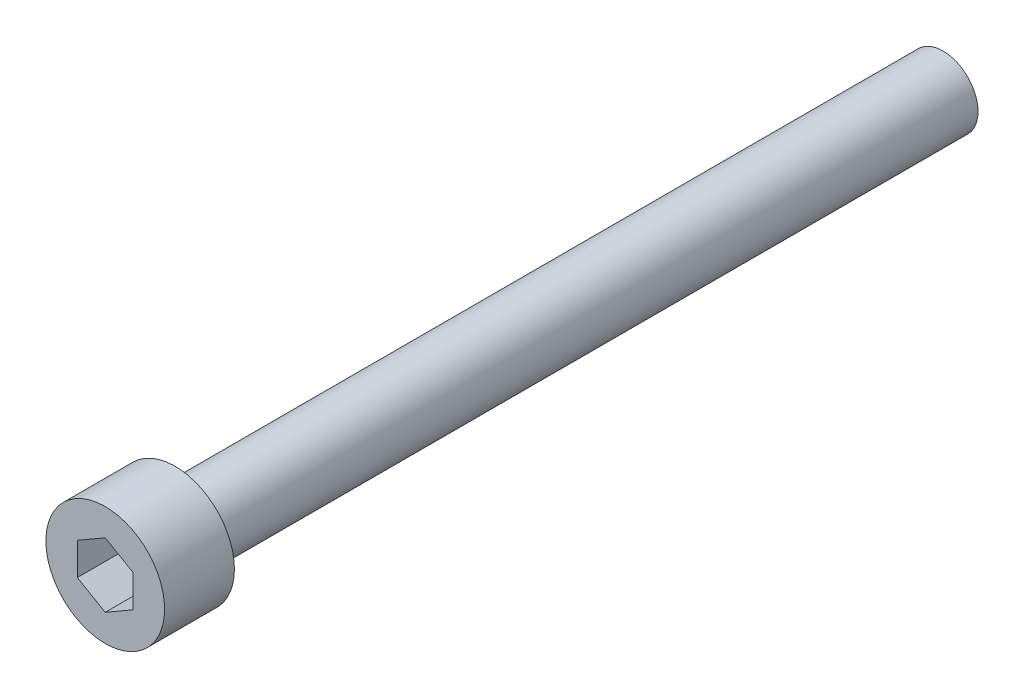
ISO-10303-21;
HEADER;
FILE_DESCRIPTION(('STEP AP214'),'2;1');
FILE_NAME('part.step','',(''),(''),'','','');
FILE_SCHEMA(('AUTOMOTIVE_DESIGN { 1 0 10303 214 1 1 1 1 }'));
ENDSEC;
DATA;
#1=APPLICATION_CONTEXT('core data for automotive mechanical design processes');
#2=APPLICATION_PROTOCOL_DEFINITION('international standard','automotive_design',2000,#1);
#3=PRODUCT_CONTEXT('',#1,'mechanical');
#4=PRODUCT('Part','Part','',(#3));
#5=PRODUCT_RELATED_PRODUCT_CATEGORY('part','',(#4));
#6=PRODUCT_DEFINITION_FORMATION('','',#4);
#7=PRODUCT_DEFINITION_CONTEXT('part definition',#1,'design');
#8=PRODUCT_DEFINITION('design','',#6,#7);
#9=PRODUCT_DEFINITION_SHAPE('','',#8);
#10=(LENGTH_UNIT() NAMED_UNIT(*) SI_UNIT(.MILLI.,.METRE.));
#11=(NAMED_UNIT(*) PLANE_ANGLE_UNIT() SI_UNIT($,.RADIAN.));
#12=(NAMED_UNIT(*) SI_UNIT($,.STERADIAN.) SOLID_ANGLE_UNIT());
#13=UNCERTAINTY_MEASURE_WITH_UNIT(LENGTH_MEASURE(1.E-05),#10,'distance_accuracy_value','');
#14=(GEOMETRIC_REPRESENTATION_CONTEXT(3) GLOBAL_UNCERTAINTY_ASSIGNED_CONTEXT((#13)) GLOBAL_UNIT_ASSIGNED_CONTEXT((#10,
#11,#12)) REPRESENTATION_CONTEXT('',''));
#15=CARTESIAN_POINT('',(0.,0.,0.));
#16=DIRECTION('',(0.,0.,1.));
#17=DIRECTION('',(1.,0.,0.));
#18=AXIS2_PLACEMENT_3D('',#15,#16,#17);
#19=CARTESIAN_POINT('',(0.,0.,55.));
#20=DIRECTION('',(0.,0.,-1.));
#21=DIRECTION('',(-1.,0.,0.));
#22=AXIS2_PLACEMENT_3D('',#19,#20,#21);
#23=CYLINDRICAL_SURFACE('',#22,2.5);
#24=CARTESIAN_POINT('',(0.,0.,55.));
#25=DIRECTION('',(0.,0.,1.));
#26=DIRECTION('',(1.,0.,0.));
#27=AXIS2_PLACEMENT_3D('',#24,#25,#26);
#28=CIRCLE('',#27,2.5);
#29=CARTESIAN_POINT('',(2.5,0.,55.));
#30=VERTEX_POINT('',#29);
#31=EDGE_CURVE('E11',#30,#30,#28,.T.);
#32=ORIENTED_EDGE('',*,*,#31,.F.);
#33=EDGE_LOOP('',(#32));
#34=FACE_BOUND('',#33,.T.);
#35=CARTESIAN_POINT('',(0.,0.,0.));
#36=DIRECTION('',(0.,0.,1.));
#37=DIRECTION('',(1.,0.,0.));
#38=AXIS2_PLACEMENT_3D('',#35,#36,#37);
#39=CIRCLE('',#38,2.5);
#40=CARTESIAN_POINT('',(2.5,0.,0.));
#41=VERTEX_POINT('',#40);
#42=EDGE_CURVE('E37',#41,#41,#39,.T.);
#43=ORIENTED_EDGE('',*,*,#42,.T.);
#44=EDGE_LOOP('',(#43));
#45=FACE_BOUND('',#44,.T.);
#46=ADVANCED_FACE('F34',(#34,#45),#23,.T.);
#47=CARTESIAN_POINT('',(0.,0.,0.));
#48=DIRECTION('',(0.,0.,1.));
#49=DIRECTION('',(1.,0.,0.));
#50=AXIS2_PLACEMENT_3D('',#47,#48,#49);
#51=PLANE('',#50);
#52=ORIENTED_EDGE('',*,*,#42,.F.);
#53=EDGE_LOOP('',(#52));
#54=FACE_BOUND('',#53,.T.);
#55=ADVANCED_FACE('F165',(#54),#51,.F.);
#56=CARTESIAN_POINT('',(0.,0.,60.));
#57=DIRECTION('',(0.,0.,-1.));
#58=DIRECTION('',(-1.,0.,0.));
#59=AXIS2_PLACEMENT_3D('',#56,#57,#58);
#60=CYLINDRICAL_SURFACE('',#59,4.25);
#61=CARTESIAN_POINT('',(0.,0.,60.));
#62=DIRECTION('',(0.,0.,1.));
#63=DIRECTION('',(1.,0.,0.));
#64=AXIS2_PLACEMENT_3D('',#61,#62,#63);
#65=CIRCLE('',#64,4.25);
#66=CARTESIAN_POINT('',(4.25,0.,60.));
#67=VERTEX_POINT('',#66);
#68=EDGE_CURVE('E141',#67,#67,#65,.T.);
#69=ORIENTED_EDGE('',*,*,#68,.F.);
#70=EDGE_LOOP('',(#69));
#71=FACE_BOUND('',#70,.T.);
#72=CARTESIAN_POINT('',(0.,0.,55.));
#73=DIRECTION('',(0.,0.,1.));
#74=DIRECTION('',(1.,0.,0.));
#75=AXIS2_PLACEMENT_3D('',#72,#73,#74);
#76=CIRCLE('',#75,4.25);
#77=CARTESIAN_POINT('',(4.25,0.,55.));
#78=VERTEX_POINT('',#77);
#79=EDGE_CURVE('E135',#78,#78,#76,.T.);
#80=ORIENTED_EDGE('',*,*,#79,.T.);
#81=EDGE_LOOP('',(#80));
#82=FACE_BOUND('',#81,.T.);
#83=ADVANCED_FACE('F147',(#71,#82),#60,.T.);
#84=CARTESIAN_POINT('',(0.,0.,60.));
#85=DIRECTION('',(0.,0.,1.));
#86=DIRECTION('',(1.,0.,0.));
#87=AXIS2_PLACEMENT_3D('',#84,#85,#86);
#88=PLANE('',#87);
#89=DIRECTION('',(-0.866025403784439,0.5,0.));
#90=VECTOR('',#89,1.);
#91=CARTESIAN_POINT('',(2.,1.15470053837925,60.));
#92=LINE('',#91,#90);
#93=CARTESIAN_POINT('',(2.,1.15470053837925,60.));
#94=VERTEX_POINT('',#93);
#95=CARTESIAN_POINT('',(0.,2.3094010767585,60.));
#96=VERTEX_POINT('',#95);
#97=EDGE_CURVE('E48',#94,#96,#92,.T.);
#98=ORIENTED_EDGE('',*,*,#97,.F.);
#99=DIRECTION('',(0.,1.,0.));
#100=VECTOR('',#99,1.);
#101=CARTESIAN_POINT('',(2.,-1.15470053837925,60.));
#102=LINE('',#101,#100);
#103=CARTESIAN_POINT('',(2.,-1.15470053837925,60.));
#104=VERTEX_POINT('',#103);
#105=EDGE_CURVE('E131',#104,#94,#102,.T.);
#106=ORIENTED_EDGE('',*,*,#105,.F.);
#107=DIRECTION('',(0.866025403784439,0.5,0.));
#108=VECTOR('',#107,1.);
#109=CARTESIAN_POINT('',(0.,-2.3094010767585,60.));
#110=LINE('',#109,#108);
#111=CARTESIAN_POINT('',(0.,-2.3094010767585,60.));
#112=VERTEX_POINT('',#111);
#113=EDGE_CURVE('E129',#112,#104,#110,.T.);
#114=ORIENTED_EDGE('',*,*,#113,.F.);
#115=DIRECTION('',(0.866025403784439,-0.5,0.));
#116=VECTOR('',#115,1.);
#117=CARTESIAN_POINT('',(-2.,-1.15470053837925,60.));
#118=LINE('',#117,#116);
#119=CARTESIAN_POINT('',(-2.,-1.15470053837925,60.));
#120=VERTEX_POINT('',#119);
#121=EDGE_CURVE('E96',#120,#112,#118,.T.);
#122=ORIENTED_EDGE('',*,*,#121,.F.);
#123=DIRECTION('',(0.,-1.,0.));
#124=VECTOR('',#123,1.);
#125=CARTESIAN_POINT('',(-2.,1.15470053837925,60.));
#126=LINE('',#125,#124);
#127=CARTESIAN_POINT('',(-2.,1.15470053837925,60.));
#128=VERTEX_POINT('',#127);
#129=EDGE_CURVE('E125',#128,#120,#126,.T.);
#130=ORIENTED_EDGE('',*,*,#129,.F.);
#131=DIRECTION('',(-0.866025403784439,-0.5,0.));
#132=VECTOR('',#131,1.);
#133=CARTESIAN_POINT('',(0.,2.3094010767585,60.));
#134=LINE('',#133,#132);
#135=EDGE_CURVE('E122',#96,#128,#134,.T.);
#136=ORIENTED_EDGE('',*,*,#135,.F.);
#137=EDGE_LOOP('',(#98,#106,#114,#122,#130,#136));
#138=FACE_BOUND('',#137,.T.);
#139=ORIENTED_EDGE('',*,*,#68,.T.);
#140=EDGE_LOOP('',(#139));
#141=FACE_BOUND('',#140,.T.);
#142=ADVANCED_FACE('F152',(#138,#141),#88,.T.);
#143=CARTESIAN_POINT('',(0.,0.,55.));
#144=DIRECTION('',(0.,0.,1.));
#145=DIRECTION('',(1.,0.,0.));
#146=AXIS2_PLACEMENT_3D('',#143,#144,#145);
#147=PLANE('',#146);
#148=ORIENTED_EDGE('',*,*,#31,.T.);
#149=EDGE_LOOP('',(#148));
#150=FACE_BOUND('',#149,.T.);
#151=ORIENTED_EDGE('',*,*,#79,.F.);
#152=EDGE_LOOP('',(#151));
#153=FACE_BOUND('',#152,.T.);
#154=ADVANCED_FACE('F149',(#150,#153),#147,.F.);
#155=CARTESIAN_POINT('',(2.,1.15470053837925,57.));
#156=DIRECTION('',(0.5,0.866025403784439,0.));
#157=DIRECTION('',(-0.866025403784439,0.5,0.));
#158=AXIS2_PLACEMENT_3D('',#155,#156,#157);
#159=PLANE('',#158);
#160=ORIENTED_EDGE('',*,*,#97,.T.);
#161=DIRECTION('',(0.,0.,1.));
#162=VECTOR('',#161,1.);
#163=CARTESIAN_POINT('',(0.,2.3094010767585,57.));
#164=LINE('',#163,#162);
#165=CARTESIAN_POINT('',(0.,2.3094010767585,57.));
#166=VERTEX_POINT('',#165);
#167=EDGE_CURVE('E78',#166,#96,#164,.T.);
#168=ORIENTED_EDGE('',*,*,#167,.F.);
#169=DIRECTION('',(-0.866025403784439,0.5,0.));
#170=VECTOR('',#169,1.);
#171=CARTESIAN_POINT('',(2.,1.15470053837925,57.));
#172=LINE('',#171,#170);
#173=CARTESIAN_POINT('',(2.,1.15470053837925,57.));
#174=VERTEX_POINT('',#173);
#175=EDGE_CURVE('E133',#174,#166,#172,.T.);
#176=ORIENTED_EDGE('',*,*,#175,.F.);
#177=DIRECTION('',(0.,0.,1.));
#178=VECTOR('',#177,1.);
#179=CARTESIAN_POINT('',(2.,1.15470053837925,57.));
#180=LINE('',#179,#178);
#181=EDGE_CURVE('E56',#174,#94,#180,.T.);
#182=ORIENTED_EDGE('',*,*,#181,.T.);
#183=EDGE_LOOP('',(#160,#168,#176,#182));
#184=FACE_BOUND('',#183,.T.);
#185=ADVANCED_FACE('F151',(#184),#159,.F.);
#186=CARTESIAN_POINT('',(2.,-1.15470053837925,57.));
#187=DIRECTION('',(1.,0.,0.));
#188=DIRECTION('',(0.,0.,-1.));
#189=AXIS2_PLACEMENT_3D('',#186,#187,#188);
#190=PLANE('',#189);
#191=ORIENTED_EDGE('',*,*,#105,.T.);
#192=ORIENTED_EDGE('',*,*,#181,.F.);
#193=DIRECTION('',(0.,1.,0.));
#194=VECTOR('',#193,1.);
#195=CARTESIAN_POINT('',(2.,-1.15470053837925,57.));
#196=LINE('',#195,#194);
#197=CARTESIAN_POINT('',(2.,-1.15470053837925,57.));
#198=VERTEX_POINT('',#197);
#199=EDGE_CURVE('E108',#198,#174,#196,.T.);
#200=ORIENTED_EDGE('',*,*,#199,.F.);
#201=DIRECTION('',(0.,0.,1.));
#202=VECTOR('',#201,1.);
#203=CARTESIAN_POINT('',(2.,-1.15470053837925,57.));
#204=LINE('',#203,#202);
#205=EDGE_CURVE('E100',#198,#104,#204,.T.);
#206=ORIENTED_EDGE('',*,*,#205,.T.);
#207=EDGE_LOOP('',(#191,#192,#200,#206));
#208=FACE_BOUND('',#207,.T.);
#209=ADVANCED_FACE('F159',(#208),#190,.F.);
#210=CARTESIAN_POINT('',(0.,-2.3094010767585,57.));
#211=DIRECTION('',(0.5,-0.866025403784439,0.));
#212=DIRECTION('',(0.866025403784439,0.5,0.));
#213=AXIS2_PLACEMENT_3D('',#210,#211,#212);
#214=PLANE('',#213);
#215=ORIENTED_EDGE('',*,*,#113,.T.);
#216=ORIENTED_EDGE('',*,*,#205,.F.);
#217=DIRECTION('',(0.866025403784439,0.5,0.));
#218=VECTOR('',#217,1.);
#219=CARTESIAN_POINT('',(0.,-2.3094010767585,57.));
#220=LINE('',#219,#218);
#221=CARTESIAN_POINT('',(0.,-2.3094010767585,57.));
#222=VERTEX_POINT('',#221);
#223=EDGE_CURVE('E104',#222,#198,#220,.T.);
#224=ORIENTED_EDGE('',*,*,#223,.F.);
#225=DIRECTION('',(0.,0.,1.));
#226=VECTOR('',#225,1.);
#227=CARTESIAN_POINT('',(0.,-2.3094010767585,57.));
#228=LINE('',#227,#226);
#229=EDGE_CURVE('E89',#222,#112,#228,.T.);
#230=ORIENTED_EDGE('',*,*,#229,.T.);
#231=EDGE_LOOP('',(#215,#216,#224,#230));
#232=FACE_BOUND('',#231,.T.);
#233=ADVANCED_FACE('F105',(#232),#214,.F.);
#234=CARTESIAN_POINT('',(-2.,-1.15470053837925,57.));
#235=DIRECTION('',(-0.5,-0.866025403784439,0.));
#236=DIRECTION('',(0.866025403784439,-0.5,0.));
#237=AXIS2_PLACEMENT_3D('',#234,#235,#236);
#238=PLANE('',#237);
#239=ORIENTED_EDGE('',*,*,#121,.T.);
#240=ORIENTED_EDGE('',*,*,#229,.F.);
#241=DIRECTION('',(0.866025403784439,-0.5,0.));
#242=VECTOR('',#241,1.);
#243=CARTESIAN_POINT('',(-2.,-1.15470053837925,57.));
#244=LINE('',#243,#242);
#245=CARTESIAN_POINT('',(-2.,-1.15470053837925,57.));
#246=VERTEX_POINT('',#245);
#247=EDGE_CURVE('E93',#246,#222,#244,.T.);
#248=ORIENTED_EDGE('',*,*,#247,.F.);
#249=DIRECTION('',(0.,0.,1.));
#250=VECTOR('',#249,1.);
#251=CARTESIAN_POINT('',(-2.,-1.15470053837925,57.));
#252=LINE('',#251,#250);
#253=EDGE_CURVE('E101',#246,#120,#252,.T.);
#254=ORIENTED_EDGE('',*,*,#253,.T.);
#255=EDGE_LOOP('',(#239,#240,#248,#254));
#256=FACE_BOUND('',#255,.T.);
#257=ADVANCED_FACE('F91',(#256),#238,.F.);
#258=CARTESIAN_POINT('',(-2.,1.15470053837925,57.));
#259=DIRECTION('',(-1.,0.,0.));
#260=DIRECTION('',(0.,-1.,0.));
#261=AXIS2_PLACEMENT_3D('',#258,#259,#260);
#262=PLANE('',#261);
#263=ORIENTED_EDGE('',*,*,#129,.T.);
#264=ORIENTED_EDGE('',*,*,#253,.F.);
#265=DIRECTION('',(0.,-1.,0.));
#266=VECTOR('',#265,1.);
#267=CARTESIAN_POINT('',(-2.,1.15470053837925,57.));
#268=LINE('',#267,#266);
#269=CARTESIAN_POINT('',(-2.,1.15470053837925,57.));
#270=VERTEX_POINT('',#269);
#271=EDGE_CURVE('E114',#270,#246,#268,.T.);
#272=ORIENTED_EDGE('',*,*,#271,.F.);
#273=DIRECTION('',(0.,0.,1.));
#274=VECTOR('',#273,1.);
#275=CARTESIAN_POINT('',(-2.,1.15470053837925,57.));
#276=LINE('',#275,#274);
#277=EDGE_CURVE('E138',#270,#128,#276,.T.);
#278=ORIENTED_EDGE('',*,*,#277,.T.);
#279=EDGE_LOOP('',(#263,#264,#272,#278));
#280=FACE_BOUND('',#279,.T.);
#281=ADVANCED_FACE('F220',(#280),#262,.F.);
#282=CARTESIAN_POINT('',(0.,2.3094010767585,57.));
#283=DIRECTION('',(-0.5,0.866025403784439,0.));
#284=DIRECTION('',(-0.866025403784439,-0.5,0.));
#285=AXIS2_PLACEMENT_3D('',#282,#283,#284);
#286=PLANE('',#285);
#287=ORIENTED_EDGE('',*,*,#135,.T.);
#288=ORIENTED_EDGE('',*,*,#277,.F.);
#289=DIRECTION('',(-0.866025403784439,-0.5,0.));
#290=VECTOR('',#289,1.);
#291=CARTESIAN_POINT('',(0.,2.3094010767585,57.));
#292=LINE('',#291,#290);
#293=EDGE_CURVE('E116',#166,#270,#292,.T.);
#294=ORIENTED_EDGE('',*,*,#293,.F.);
#295=ORIENTED_EDGE('',*,*,#167,.T.);
#296=EDGE_LOOP('',(#287,#288,#294,#295));
#297=FACE_BOUND('',#296,.T.);
#298=ADVANCED_FACE('F229',(#297),#286,.F.);
#299=CARTESIAN_POINT('',(0.,0.,57.));
#300=DIRECTION('',(0.,0.,1.));
#301=DIRECTION('',(1.,0.,0.));
#302=AXIS2_PLACEMENT_3D('',#299,#300,#301);
#303=PLANE('',#302);
#304=ORIENTED_EDGE('',*,*,#175,.T.);
#305=ORIENTED_EDGE('',*,*,#293,.T.);
#306=ORIENTED_EDGE('',*,*,#271,.T.);
#307=ORIENTED_EDGE('',*,*,#247,.T.);
#308=ORIENTED_EDGE('',*,*,#223,.T.);
#309=ORIENTED_EDGE('',*,*,#199,.T.);
#310=EDGE_LOOP('',(#304,#305,#306,#307,#308,#309));
#311=FACE_BOUND('',#310,.T.);
#312=ADVANCED_FACE('F111',(#311),#303,.T.);
#313=CLOSED_SHELL('',(#46,#55,#83,#142,#154,#185,#209,#233,#257,#281,#298,#312));
#314=MANIFOLD_SOLID_BREP('B2',#313);
#315=ADVANCED_BREP_SHAPE_REPRESENTATION('',(#18,#314),#14);
#316=SHAPE_DEFINITION_REPRESENTATION(#9,#315);
ENDSEC;
END-ISO-10303-21;
